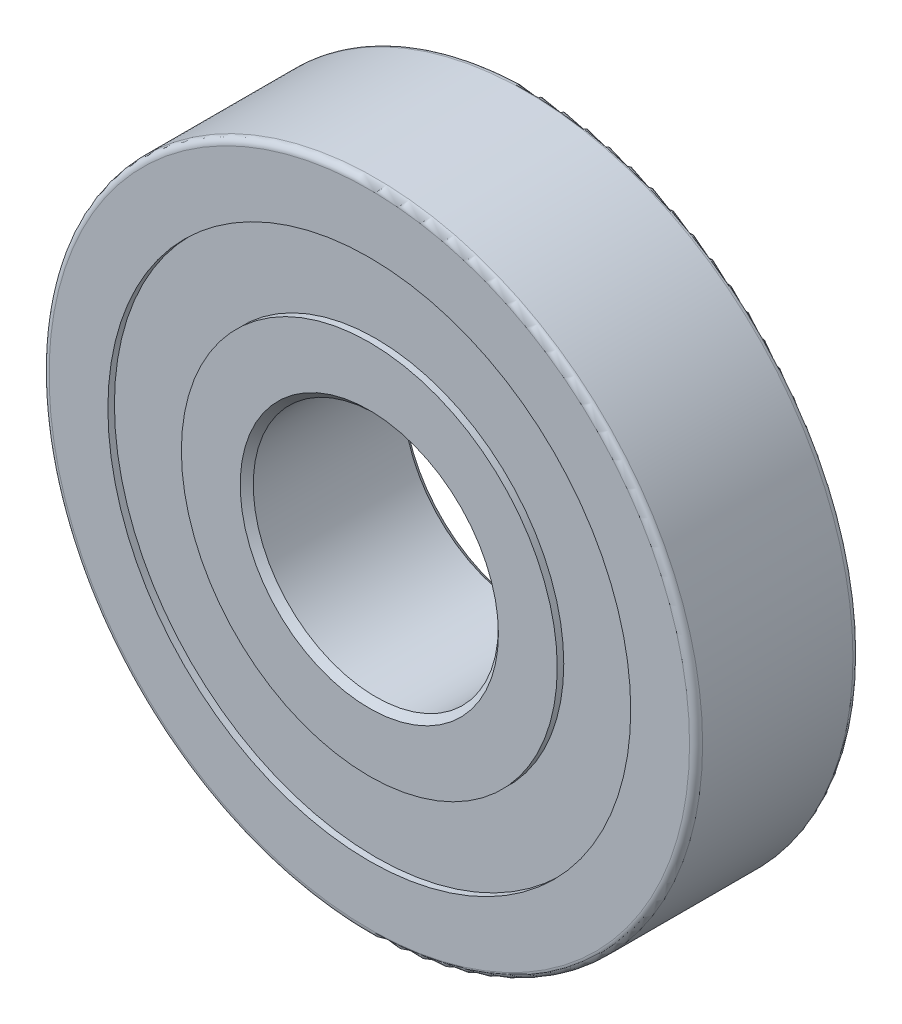
ISO-10303-21;
HEADER;
FILE_DESCRIPTION(('STEP AP214'),'2;1');
FILE_NAME('part.step','',(''),(''),'','','');
FILE_SCHEMA(('AUTOMOTIVE_DESIGN { 1 0 10303 214 1 1 1 1 }'));
ENDSEC;
DATA;
#1=APPLICATION_CONTEXT('core data for automotive mechanical design processes');
#2=APPLICATION_PROTOCOL_DEFINITION('international standard','automotive_design',2000,#1);
#3=PRODUCT_CONTEXT('',#1,'mechanical');
#4=PRODUCT('Part','Part','',(#3));
#5=PRODUCT_RELATED_PRODUCT_CATEGORY('part','',(#4));
#6=PRODUCT_DEFINITION_FORMATION('','',#4);
#7=PRODUCT_DEFINITION_CONTEXT('part definition',#1,'design');
#8=PRODUCT_DEFINITION('design','',#6,#7);
#9=PRODUCT_DEFINITION_SHAPE('','',#8);
#10=(LENGTH_UNIT() NAMED_UNIT(*) SI_UNIT(.MILLI.,.METRE.));
#11=(NAMED_UNIT(*) PLANE_ANGLE_UNIT() SI_UNIT($,.RADIAN.));
#12=(NAMED_UNIT(*) SI_UNIT($,.STERADIAN.) SOLID_ANGLE_UNIT());
#13=UNCERTAINTY_MEASURE_WITH_UNIT(LENGTH_MEASURE(1.E-05),#10,'distance_accuracy_value','');
#14=(GEOMETRIC_REPRESENTATION_CONTEXT(3) GLOBAL_UNCERTAINTY_ASSIGNED_CONTEXT((#13)) GLOBAL_UNIT_ASSIGNED_CONTEXT((#10,
#11,#12)) REPRESENTATION_CONTEXT('',''));
#15=CARTESIAN_POINT('',(0.,0.,0.));
#16=DIRECTION('',(0.,0.,1.));
#17=DIRECTION('',(1.,0.,0.));
#18=AXIS2_PLACEMENT_3D('',#15,#16,#17);
#19=CARTESIAN_POINT('',(0.,0.,1.5875));
#20=DIRECTION('',(0.,0.,-1.));
#21=DIRECTION('',(-1.,0.,0.));
#22=AXIS2_PLACEMENT_3D('',#19,#20,#21);
#23=CYLINDRICAL_SURFACE('',#22,5.08);
#24=CARTESIAN_POINT('',(0.,0.,-1.5875));
#25=DIRECTION('',(0.,0.,1.));
#26=DIRECTION('',(1.,0.,0.));
#27=AXIS2_PLACEMENT_3D('',#24,#25,#26);
#28=CIRCLE('',#27,5.08);
#29=CARTESIAN_POINT('',(5.08,0.,-1.5875));
#30=VERTEX_POINT('',#29);
#31=EDGE_CURVE('E88',#30,#30,#28,.T.);
#32=ORIENTED_EDGE('',*,*,#31,.F.);
#33=EDGE_LOOP('',(#32));
#34=FACE_BOUND('',#33,.T.);
#35=CARTESIAN_POINT('',(0.,0.,-1.4605));
#36=DIRECTION('',(0.,0.,1.));
#37=DIRECTION('',(1.,0.,0.));
#38=AXIS2_PLACEMENT_3D('',#35,#36,#37);
#39=CIRCLE('',#38,5.08);
#40=CARTESIAN_POINT('',(5.08,0.,-1.4605));
#41=VERTEX_POINT('',#40);
#42=EDGE_CURVE('E91',#41,#41,#39,.T.);
#43=ORIENTED_EDGE('',*,*,#42,.T.);
#44=EDGE_LOOP('',(#43));
#45=FACE_BOUND('',#44,.T.);
#46=ADVANCED_FACE('F51',(#34,#45),#23,.F.);
#47=CARTESIAN_POINT('',(0.,0.,1.4605));
#48=DIRECTION('',(0.,0.,1.));
#49=DIRECTION('',(1.,0.,0.));
#50=AXIS2_PLACEMENT_3D('',#47,#48,#49);
#51=CIRCLE('',#50,5.08);
#52=CARTESIAN_POINT('',(5.08,0.,1.4605));
#53=VERTEX_POINT('',#52);
#54=EDGE_CURVE('E84',#53,#53,#51,.T.);
#55=ORIENTED_EDGE('',*,*,#54,.F.);
#56=EDGE_LOOP('',(#55));
#57=FACE_BOUND('',#56,.T.);
#58=CARTESIAN_POINT('',(0.,0.,1.5875));
#59=DIRECTION('',(0.,0.,1.));
#60=DIRECTION('',(1.,0.,0.));
#61=AXIS2_PLACEMENT_3D('',#58,#59,#60);
#62=CIRCLE('',#61,5.08);
#63=CARTESIAN_POINT('',(5.08,0.,1.5875));
#64=VERTEX_POINT('',#63);
#65=EDGE_CURVE('E87',#64,#64,#62,.T.);
#66=ORIENTED_EDGE('',*,*,#65,.T.);
#67=EDGE_LOOP('',(#66));
#68=FACE_BOUND('',#67,.T.);
#69=ADVANCED_FACE('F131',(#57,#68),#23,.F.);
#70=CARTESIAN_POINT('',(0.,0.,1.5875));
#71=DIRECTION('',(0.,0.,-1.));
#72=DIRECTION('',(-1.,0.,0.));
#73=AXIS2_PLACEMENT_3D('',#70,#71,#72);
#74=CYLINDRICAL_SURFACE('',#73,6.35);
#75=CARTESIAN_POINT('',(0.,0.,-1.4605));
#76=DIRECTION('',(0.,0.,1.));
#77=DIRECTION('',(1.,0.,0.));
#78=AXIS2_PLACEMENT_3D('',#75,#76,#77);
#79=CIRCLE('',#78,6.35);
#80=CARTESIAN_POINT('',(6.35,0.,-1.4605));
#81=VERTEX_POINT('',#80);
#82=EDGE_CURVE('E78',#81,#81,#79,.T.);
#83=ORIENTED_EDGE('',*,*,#82,.T.);
#84=EDGE_LOOP('',(#83));
#85=FACE_BOUND('',#84,.T.);
#86=CARTESIAN_POINT('',(0.,0.,1.4605));
#87=DIRECTION('',(0.,0.,1.));
#88=DIRECTION('',(1.,0.,0.));
#89=AXIS2_PLACEMENT_3D('',#86,#87,#88);
#90=CIRCLE('',#89,6.35);
#91=CARTESIAN_POINT('',(6.35,0.,1.4605));
#92=VERTEX_POINT('',#91);
#93=EDGE_CURVE('E81',#92,#92,#90,.F.);
#94=ORIENTED_EDGE('',*,*,#93,.T.);
#95=EDGE_LOOP('',(#94));
#96=FACE_BOUND('',#95,.T.);
#97=ADVANCED_FACE('F137',(#85,#96),#74,.T.);
#98=CARTESIAN_POINT('',(0.,0.,1.5875));
#99=DIRECTION('',(0.,0.,1.));
#100=DIRECTION('',(1.,0.,0.));
#101=AXIS2_PLACEMENT_3D('',#98,#99,#100);
#102=PLANE('',#101);
#103=CARTESIAN_POINT('',(0.,0.,1.5875));
#104=DIRECTION('',(0.,0.,1.));
#105=DIRECTION('',(1.,0.,0.));
#106=AXIS2_PLACEMENT_3D('',#103,#104,#105);
#107=CIRCLE('',#106,6.223);
#108=CARTESIAN_POINT('',(6.223,0.,1.5875));
#109=VERTEX_POINT('',#108);
#110=EDGE_CURVE('E72',#109,#109,#107,.T.);
#111=ORIENTED_EDGE('',*,*,#110,.T.);
#112=EDGE_LOOP('',(#111));
#113=FACE_BOUND('',#112,.T.);
#114=ORIENTED_EDGE('',*,*,#65,.F.);
#115=EDGE_LOOP('',(#114));
#116=FACE_BOUND('',#115,.T.);
#117=ADVANCED_FACE('F244',(#113,#116),#102,.T.);
#118=CARTESIAN_POINT('',(0.,0.,-1.5875));
#119=DIRECTION('',(0.,0.,1.));
#120=DIRECTION('',(1.,0.,0.));
#121=AXIS2_PLACEMENT_3D('',#118,#119,#120);
#122=PLANE('',#121);
#123=CARTESIAN_POINT('',(0.,0.,-1.5875));
#124=DIRECTION('',(0.,0.,1.));
#125=DIRECTION('',(1.,0.,0.));
#126=AXIS2_PLACEMENT_3D('',#123,#124,#125);
#127=CIRCLE('',#126,6.223);
#128=CARTESIAN_POINT('',(6.223,0.,-1.5875));
#129=VERTEX_POINT('',#128);
#130=EDGE_CURVE('E75',#129,#129,#127,.F.);
#131=ORIENTED_EDGE('',*,*,#130,.T.);
#132=EDGE_LOOP('',(#131));
#133=FACE_BOUND('',#132,.T.);
#134=ORIENTED_EDGE('',*,*,#31,.T.);
#135=EDGE_LOOP('',(#134));
#136=FACE_BOUND('',#135,.T.);
#137=ADVANCED_FACE('F206',(#133,#136),#122,.F.);
#138=CARTESIAN_POINT('',(0.,0.,1.4605));
#139=DIRECTION('',(0.,0.,1.));
#140=DIRECTION('',(1.,0.,0.));
#141=AXIS2_PLACEMENT_3D('',#138,#139,#140);
#142=PLANE('',#141);
#143=ORIENTED_EDGE('',*,*,#54,.T.);
#144=EDGE_LOOP('',(#143));
#145=FACE_BOUND('',#144,.T.);
#146=CARTESIAN_POINT('',(0.,0.,1.4605));
#147=DIRECTION('',(0.,0.,1.));
#148=DIRECTION('',(1.,0.,0.));
#149=AXIS2_PLACEMENT_3D('',#146,#147,#148);
#150=CIRCLE('',#149,3.652012);
#151=CARTESIAN_POINT('',(3.652012,0.,1.4605));
#152=VERTEX_POINT('',#151);
#153=EDGE_CURVE('E96',#152,#152,#150,.T.);
#154=ORIENTED_EDGE('',*,*,#153,.F.);
#155=EDGE_LOOP('',(#154));
#156=FACE_BOUND('',#155,.T.);
#157=ADVANCED_FACE('F196',(#145,#156),#142,.T.);
#158=CARTESIAN_POINT('',(0.,0.,-1.4605));
#159=DIRECTION('',(0.,0.,1.));
#160=DIRECTION('',(1.,0.,0.));
#161=AXIS2_PLACEMENT_3D('',#158,#159,#160);
#162=PLANE('',#161);
#163=ORIENTED_EDGE('',*,*,#42,.F.);
#164=EDGE_LOOP('',(#163));
#165=FACE_BOUND('',#164,.T.);
#166=CARTESIAN_POINT('',(0.,0.,-1.4605));
#167=DIRECTION('',(0.,0.,1.));
#168=DIRECTION('',(1.,0.,0.));
#169=AXIS2_PLACEMENT_3D('',#166,#167,#168);
#170=CIRCLE('',#169,3.652012);
#171=CARTESIAN_POINT('',(3.652012,0.,-1.4605));
#172=VERTEX_POINT('',#171);
#173=EDGE_CURVE('E99',#172,#172,#170,.F.);
#174=ORIENTED_EDGE('',*,*,#173,.F.);
#175=EDGE_LOOP('',(#174));
#176=FACE_BOUND('',#175,.T.);
#177=ADVANCED_FACE('F128',(#165,#176),#162,.F.);
#178=CARTESIAN_POINT('',(0.,0.,1.5875));
#179=DIRECTION('',(0.,0.,-1.));
#180=DIRECTION('',(-1.,0.,0.));
#181=AXIS2_PLACEMENT_3D('',#178,#179,#180);
#182=CYLINDRICAL_SURFACE('',#181,3.652012);
#183=CARTESIAN_POINT('',(0.,0.,-1.5875));
#184=DIRECTION('',(0.,0.,1.));
#185=DIRECTION('',(1.,0.,0.));
#186=AXIS2_PLACEMENT_3D('',#183,#184,#185);
#187=CIRCLE('',#186,3.652012);
#188=CARTESIAN_POINT('',(3.652012,0.,-1.5875));
#189=VERTEX_POINT('',#188);
#190=EDGE_CURVE('E103',#189,#189,#187,.T.);
#191=ORIENTED_EDGE('',*,*,#190,.T.);
#192=EDGE_LOOP('',(#191));
#193=FACE_BOUND('',#192,.T.);
#194=ORIENTED_EDGE('',*,*,#173,.T.);
#195=EDGE_LOOP('',(#194));
#196=FACE_BOUND('',#195,.T.);
#197=ADVANCED_FACE('F116',(#193,#196),#182,.T.);
#198=CARTESIAN_POINT('',(0.,0.,1.5875));
#199=DIRECTION('',(0.,0.,-1.));
#200=DIRECTION('',(-1.,0.,0.));
#201=AXIS2_PLACEMENT_3D('',#198,#199,#200);
#202=CYLINDRICAL_SURFACE('',#201,2.382012);
#203=CARTESIAN_POINT('',(0.,0.,1.4605));
#204=DIRECTION('',(0.,0.,1.));
#205=DIRECTION('',(1.,0.,0.));
#206=AXIS2_PLACEMENT_3D('',#203,#204,#205);
#207=CIRCLE('',#206,2.382012);
#208=CARTESIAN_POINT('',(2.382012,0.,1.4605));
#209=VERTEX_POINT('',#208);
#210=EDGE_CURVE('E63',#209,#209,#207,.T.);
#211=ORIENTED_EDGE('',*,*,#210,.T.);
#212=EDGE_LOOP('',(#211));
#213=FACE_BOUND('',#212,.T.);
#214=CARTESIAN_POINT('',(0.,0.,-1.4605));
#215=DIRECTION('',(0.,0.,1.));
#216=DIRECTION('',(1.,0.,0.));
#217=AXIS2_PLACEMENT_3D('',#214,#215,#216);
#218=CIRCLE('',#217,2.382012);
#219=CARTESIAN_POINT('',(2.382012,0.,-1.4605));
#220=VERTEX_POINT('',#219);
#221=EDGE_CURVE('E67',#220,#220,#218,.F.);
#222=ORIENTED_EDGE('',*,*,#221,.T.);
#223=EDGE_LOOP('',(#222));
#224=FACE_BOUND('',#223,.T.);
#225=ADVANCED_FACE('F113',(#213,#224),#202,.F.);
#226=ORIENTED_EDGE('',*,*,#153,.T.);
#227=EDGE_LOOP('',(#226));
#228=FACE_BOUND('',#227,.T.);
#229=CARTESIAN_POINT('',(0.,0.,1.5875));
#230=DIRECTION('',(0.,0.,1.));
#231=DIRECTION('',(1.,0.,0.));
#232=AXIS2_PLACEMENT_3D('',#229,#230,#231);
#233=CIRCLE('',#232,3.652012);
#234=CARTESIAN_POINT('',(3.652012,0.,1.5875));
#235=VERTEX_POINT('',#234);
#236=EDGE_CURVE('E102',#235,#235,#233,.T.);
#237=ORIENTED_EDGE('',*,*,#236,.F.);
#238=EDGE_LOOP('',(#237));
#239=FACE_BOUND('',#238,.T.);
#240=ADVANCED_FACE('F111',(#228,#239),#182,.T.);
#241=CARTESIAN_POINT('',(0.,0.,1.5875));
#242=DIRECTION('',(0.,0.,1.));
#243=DIRECTION('',(1.,0.,0.));
#244=AXIS2_PLACEMENT_3D('',#241,#242,#243);
#245=PLANE('',#244);
#246=CARTESIAN_POINT('',(0.,0.,1.5875));
#247=DIRECTION('',(0.,0.,1.));
#248=DIRECTION('',(1.,0.,0.));
#249=AXIS2_PLACEMENT_3D('',#246,#247,#248);
#250=CIRCLE('',#249,2.509012);
#251=CARTESIAN_POINT('',(2.509012,0.,1.5875));
#252=VERTEX_POINT('',#251);
#253=EDGE_CURVE('E59',#252,#252,#250,.F.);
#254=ORIENTED_EDGE('',*,*,#253,.T.);
#255=EDGE_LOOP('',(#254));
#256=FACE_BOUND('',#255,.T.);
#257=ORIENTED_EDGE('',*,*,#236,.T.);
#258=EDGE_LOOP('',(#257));
#259=FACE_BOUND('',#258,.T.);
#260=ADVANCED_FACE('F109',(#256,#259),#245,.T.);
#261=CARTESIAN_POINT('',(0.,0.,-1.5875));
#262=DIRECTION('',(0.,0.,1.));
#263=DIRECTION('',(1.,0.,0.));
#264=AXIS2_PLACEMENT_3D('',#261,#262,#263);
#265=PLANE('',#264);
#266=CARTESIAN_POINT('',(0.,0.,-1.5875));
#267=DIRECTION('',(0.,0.,1.));
#268=DIRECTION('',(1.,0.,0.));
#269=AXIS2_PLACEMENT_3D('',#266,#267,#268);
#270=CIRCLE('',#269,2.509012);
#271=CARTESIAN_POINT('',(2.509012,0.,-1.5875));
#272=VERTEX_POINT('',#271);
#273=EDGE_CURVE('E11',#272,#272,#270,.T.);
#274=ORIENTED_EDGE('',*,*,#273,.T.);
#275=EDGE_LOOP('',(#274));
#276=FACE_BOUND('',#275,.T.);
#277=ORIENTED_EDGE('',*,*,#190,.F.);
#278=EDGE_LOOP('',(#277));
#279=FACE_BOUND('',#278,.T.);
#280=ADVANCED_FACE('F122',(#276,#279),#265,.F.);
#281=CARTESIAN_POINT('',(0.,0.,-1.4605));
#282=DIRECTION('',(0.,0.,1.));
#283=DIRECTION('',(1.,0.,0.));
#284=AXIS2_PLACEMENT_3D('',#281,#282,#283);
#285=TOROIDAL_SURFACE('',#284,6.223,0.127);
#286=ORIENTED_EDGE('',*,*,#130,.F.);
#287=EDGE_LOOP('',(#286));
#288=FACE_BOUND('',#287,.T.);
#289=ORIENTED_EDGE('',*,*,#82,.F.);
#290=EDGE_LOOP('',(#289));
#291=FACE_BOUND('',#290,.T.);
#292=ADVANCED_FACE('F144',(#288,#291),#285,.T.);
#293=CARTESIAN_POINT('',(0.,0.,1.4605));
#294=DIRECTION('',(0.,0.,1.));
#295=DIRECTION('',(1.,0.,0.));
#296=AXIS2_PLACEMENT_3D('',#293,#294,#295);
#297=TOROIDAL_SURFACE('',#296,6.223,0.127);
#298=ORIENTED_EDGE('',*,*,#93,.F.);
#299=EDGE_LOOP('',(#298));
#300=FACE_BOUND('',#299,.T.);
#301=ORIENTED_EDGE('',*,*,#110,.F.);
#302=EDGE_LOOP('',(#301));
#303=FACE_BOUND('',#302,.T.);
#304=ADVANCED_FACE('F147',(#300,#303),#297,.T.);
#305=CARTESIAN_POINT('',(0.,0.,1.4605));
#306=DIRECTION('',(0.,0.,1.));
#307=DIRECTION('',(1.,0.,0.));
#308=AXIS2_PLACEMENT_3D('',#305,#306,#307);
#309=CONICAL_SURFACE('',#308,2.382012,0.78539816339745);
#310=ORIENTED_EDGE('',*,*,#253,.F.);
#311=EDGE_LOOP('',(#310));
#312=FACE_BOUND('',#311,.T.);
#313=ORIENTED_EDGE('',*,*,#210,.F.);
#314=EDGE_LOOP('',(#313));
#315=FACE_BOUND('',#314,.T.);
#316=ADVANCED_FACE('F150',(#312,#315),#309,.F.);
#317=CARTESIAN_POINT('',(0.,0.,-1.5875));
#318=DIRECTION('',(0.,0.,-1.));
#319=DIRECTION('',(-1.,0.,0.));
#320=AXIS2_PLACEMENT_3D('',#317,#318,#319);
#321=CONICAL_SURFACE('',#320,2.509012,0.785398163397447);
#322=ORIENTED_EDGE('',*,*,#221,.F.);
#323=EDGE_LOOP('',(#322));
#324=FACE_BOUND('',#323,.T.);
#325=ORIENTED_EDGE('',*,*,#273,.F.);
#326=EDGE_LOOP('',(#325));
#327=FACE_BOUND('',#326,.T.);
#328=ADVANCED_FACE('F54',(#324,#327),#321,.F.);
#329=CLOSED_SHELL('',(#46,#69,#97,#117,#137,#157,#177,#197,#225,#240,#260,#280,#292,#304,#316,#328));
#330=MANIFOLD_SOLID_BREP('B2',#329);
#331=ADVANCED_BREP_SHAPE_REPRESENTATION('',(#18,#330),#14);
#332=SHAPE_DEFINITION_REPRESENTATION(#9,#331);
ENDSEC;
END-ISO-10303-21;
